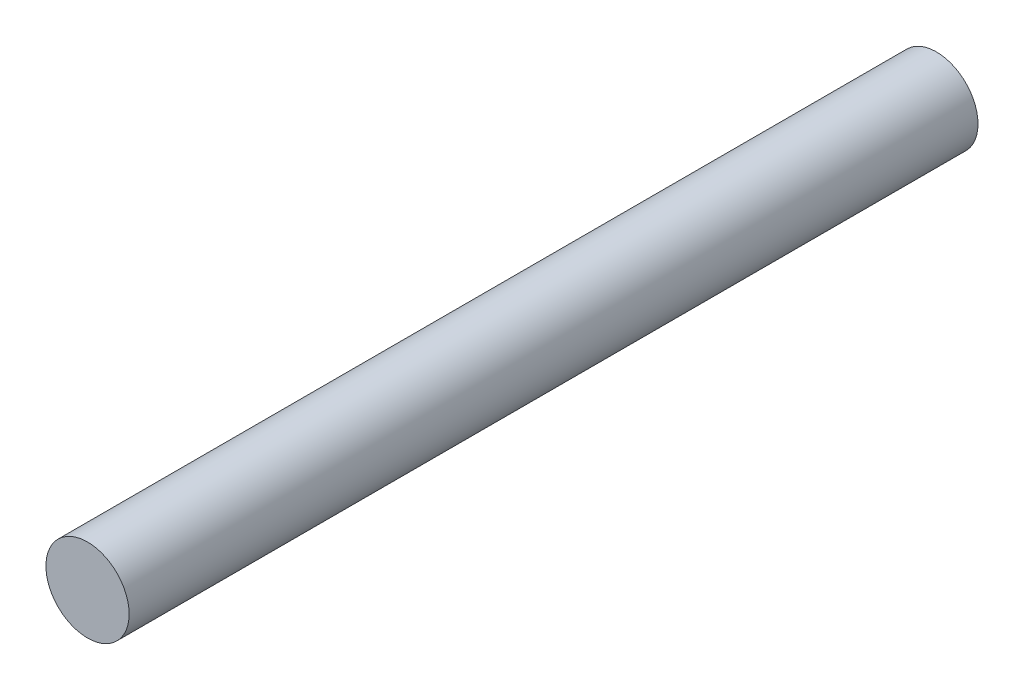
ISO-10303-21;
HEADER;
FILE_DESCRIPTION(('STEP AP214'),'2;1');
FILE_NAME('part.step','',(''),(''),'','','');
FILE_SCHEMA(('AUTOMOTIVE_DESIGN { 1 0 10303 214 1 1 1 1 }'));
ENDSEC;
DATA;
#1=APPLICATION_CONTEXT('core data for automotive mechanical design processes');
#2=APPLICATION_PROTOCOL_DEFINITION('international standard','automotive_design',2000,#1);
#3=PRODUCT_CONTEXT('',#1,'mechanical');
#4=PRODUCT('Part','Part','',(#3));
#5=PRODUCT_RELATED_PRODUCT_CATEGORY('part','',(#4));
#6=PRODUCT_DEFINITION_FORMATION('','',#4);
#7=PRODUCT_DEFINITION_CONTEXT('part definition',#1,'design');
#8=PRODUCT_DEFINITION('design','',#6,#7);
#9=PRODUCT_DEFINITION_SHAPE('','',#8);
#10=(LENGTH_UNIT() NAMED_UNIT(*) SI_UNIT(.MILLI.,.METRE.));
#11=(NAMED_UNIT(*) PLANE_ANGLE_UNIT() SI_UNIT($,.RADIAN.));
#12=(NAMED_UNIT(*) SI_UNIT($,.STERADIAN.) SOLID_ANGLE_UNIT());
#13=UNCERTAINTY_MEASURE_WITH_UNIT(LENGTH_MEASURE(1.E-05),#10,'distance_accuracy_value','');
#14=(GEOMETRIC_REPRESENTATION_CONTEXT(3) GLOBAL_UNCERTAINTY_ASSIGNED_CONTEXT((#13)) GLOBAL_UNIT_ASSIGNED_CONTEXT((#10,
#11,#12)) REPRESENTATION_CONTEXT('',''));
#15=CARTESIAN_POINT('',(0.,0.,0.));
#16=DIRECTION('',(0.,0.,1.));
#17=DIRECTION('',(1.,0.,0.));
#18=AXIS2_PLACEMENT_3D('',#15,#16,#17);
#19=CARTESIAN_POINT('',(0.,0.,127.));
#20=DIRECTION('',(0.,0.,-1.));
#21=DIRECTION('',(-1.,0.,0.));
#22=AXIS2_PLACEMENT_3D('',#19,#20,#21);
#23=CYLINDRICAL_SURFACE('',#22,6.223);
#24=CARTESIAN_POINT('',(0.,0.,127.));
#25=DIRECTION('',(0.,0.,1.));
#26=DIRECTION('',(1.,0.,0.));
#27=AXIS2_PLACEMENT_3D('',#24,#25,#26);
#28=CIRCLE('',#27,6.223);
#29=CARTESIAN_POINT('',(6.223,0.,127.));
#30=VERTEX_POINT('',#29);
#31=EDGE_CURVE('E10',#30,#30,#28,.T.);
#32=ORIENTED_EDGE('',*,*,#31,.F.);
#33=EDGE_LOOP('',(#32));
#34=FACE_BOUND('',#33,.T.);
#35=CARTESIAN_POINT('',(0.,0.,0.));
#36=DIRECTION('',(0.,0.,1.));
#37=DIRECTION('',(1.,0.,0.));
#38=AXIS2_PLACEMENT_3D('',#35,#36,#37);
#39=CIRCLE('',#38,6.223);
#40=CARTESIAN_POINT('',(6.223,0.,0.));
#41=VERTEX_POINT('',#40);
#42=EDGE_CURVE('E37',#41,#41,#39,.T.);
#43=ORIENTED_EDGE('',*,*,#42,.T.);
#44=EDGE_LOOP('',(#43));
#45=FACE_BOUND('',#44,.T.);
#46=ADVANCED_FACE('F40',(#34,#45),#23,.T.);
#47=CARTESIAN_POINT('',(0.,0.,127.));
#48=DIRECTION('',(0.,0.,1.));
#49=DIRECTION('',(1.,0.,0.));
#50=AXIS2_PLACEMENT_3D('',#47,#48,#49);
#51=PLANE('',#50);
#52=ORIENTED_EDGE('',*,*,#31,.T.);
#53=EDGE_LOOP('',(#52));
#54=FACE_BOUND('',#53,.T.);
#55=ADVANCED_FACE('F55',(#54),#51,.T.);
#56=CARTESIAN_POINT('',(0.,0.,0.));
#57=DIRECTION('',(0.,0.,1.));
#58=DIRECTION('',(1.,0.,0.));
#59=AXIS2_PLACEMENT_3D('',#56,#57,#58);
#60=PLANE('',#59);
#61=ORIENTED_EDGE('',*,*,#42,.F.);
#62=EDGE_LOOP('',(#61));
#63=FACE_BOUND('',#62,.T.);
#64=ADVANCED_FACE('F49',(#63),#60,.F.);
#65=CLOSED_SHELL('',(#46,#55,#64));
#66=MANIFOLD_SOLID_BREP('B2',#65);
#67=ADVANCED_BREP_SHAPE_REPRESENTATION('',(#18,#66),#14);
#68=SHAPE_DEFINITION_REPRESENTATION(#9,#67);
ENDSEC;
END-ISO-10303-21;
